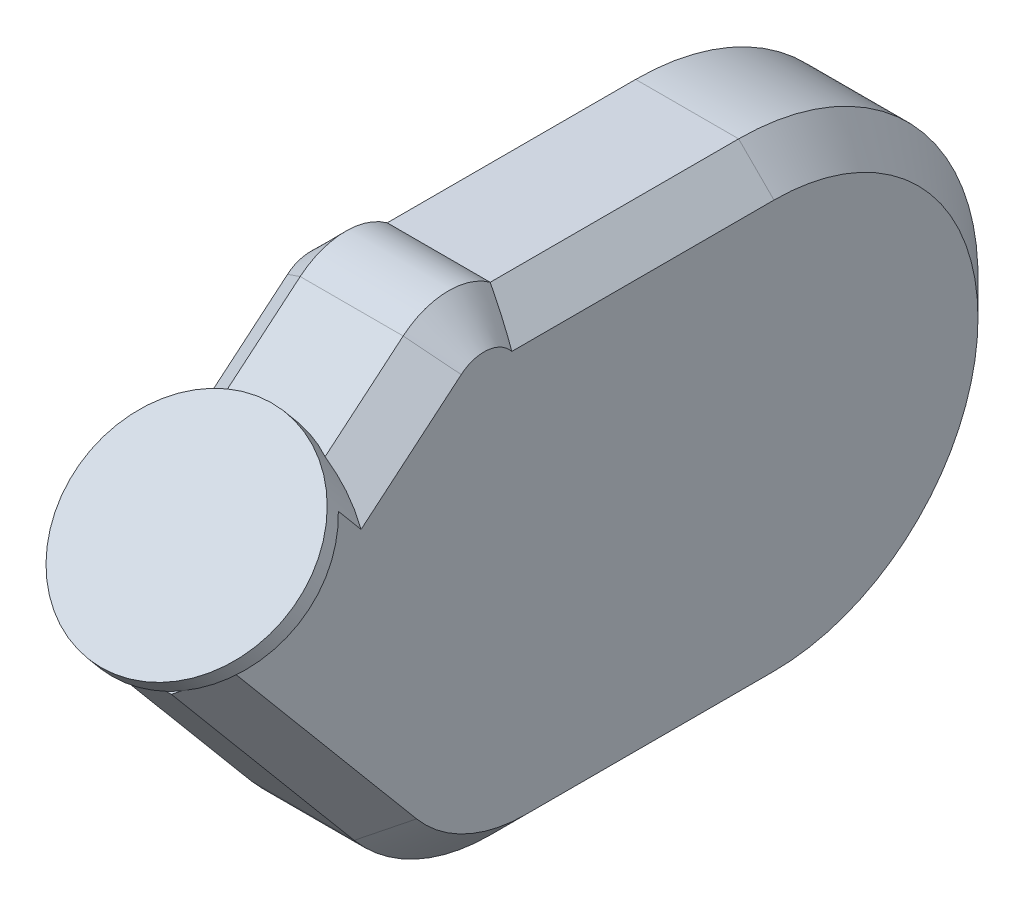
ISO-10303-21;
HEADER;
FILE_DESCRIPTION(('STEP AP214'),'2;1');
FILE_NAME('part.step','',(''),(''),'','','');
FILE_SCHEMA(('AUTOMOTIVE_DESIGN { 1 0 10303 214 1 1 1 1 }'));
ENDSEC;
DATA;
#1=APPLICATION_CONTEXT('core data for automotive mechanical design processes');
#2=APPLICATION_PROTOCOL_DEFINITION('international standard','automotive_design',2000,#1);
#3=PRODUCT_CONTEXT('',#1,'mechanical');
#4=PRODUCT('Part','Part','',(#3));
#5=PRODUCT_RELATED_PRODUCT_CATEGORY('part','',(#4));
#6=PRODUCT_DEFINITION_FORMATION('','',#4);
#7=PRODUCT_DEFINITION_CONTEXT('part definition',#1,'design');
#8=PRODUCT_DEFINITION('design','',#6,#7);
#9=PRODUCT_DEFINITION_SHAPE('','',#8);
#10=(LENGTH_UNIT() NAMED_UNIT(*) SI_UNIT(.MILLI.,.METRE.));
#11=(NAMED_UNIT(*) PLANE_ANGLE_UNIT() SI_UNIT($,.RADIAN.));
#12=(NAMED_UNIT(*) SI_UNIT($,.STERADIAN.) SOLID_ANGLE_UNIT());
#13=UNCERTAINTY_MEASURE_WITH_UNIT(LENGTH_MEASURE(1.E-05),#10,'distance_accuracy_value','');
#14=(GEOMETRIC_REPRESENTATION_CONTEXT(3) GLOBAL_UNCERTAINTY_ASSIGNED_CONTEXT((#13)) GLOBAL_UNIT_ASSIGNED_CONTEXT((#10,
#11,#12)) REPRESENTATION_CONTEXT('',''));
#15=CARTESIAN_POINT('',(0.,0.,0.));
#16=DIRECTION('',(0.,0.,1.));
#17=DIRECTION('',(1.,0.,0.));
#18=AXIS2_PLACEMENT_3D('',#15,#16,#17);
#19=CARTESIAN_POINT('',(25.0293014834067,1.5049102118823,28.9803417394481));
#20=DIRECTION('',(0.,0.766044443118977,0.64278760968654));
#21=DIRECTION('',(0.,-0.64278760968654,0.766044443118977));
#22=AXIS2_PLACEMENT_3D('',#19,#20,#21);
#23=PLANE('',#22);
#24=DIRECTION('',(-1.,0.,0.));
#25=VECTOR('',#24,1.);
#26=CARTESIAN_POINT('',(25.0293014834067,1.5049102118823,28.9803417394481));
#27=LINE('',#26,#25);
#28=CARTESIAN_POINT('',(1.84999999999999,1.5049102118823,28.9803417394481));
#29=VERTEX_POINT('',#28);
#30=CARTESIAN_POINT('',(1.65989094630084,1.50491021188229,28.9803417394481));
#31=VERTEX_POINT('',#30);
#32=EDGE_CURVE('E333',#29,#31,#27,.T.);
#33=ORIENTED_EDGE('',*,*,#32,.F.);
#34=DIRECTION('',(0.707106781186549,0.454519477672044,-0.5416752204197));
#35=VECTOR('',#34,1.);
#36=CARTESIAN_POINT('',(13.4396507417034,8.95459410924362,20.1021541910765));
#37=LINE('',#36,#35);
#38=CARTESIAN_POINT('',(2.05963838172714,1.63966316617124,28.8197494220615));
#39=VERTEX_POINT('',#38);
#40=EDGE_CURVE('E371',#29,#39,#37,.T.);
#41=ORIENTED_EDGE('',*,*,#40,.T.);
#42=CARTESIAN_POINT('',(0.,3.85179078102008,26.1834383897886));
#43=DIRECTION('',(0.,0.766044443118977,0.64278760968654));
#44=DIRECTION('',(0.,-0.64278760968654,0.766044443118977));
#45=AXIS2_PLACEMENT_3D('',#42,#43,#44);
#46=CIRCLE('',#45,4.01070501367834);
#47=EDGE_CURVE('E325',#31,#39,#46,.T.);
#48=ORIENTED_EDGE('',*,*,#47,.F.);
#49=EDGE_LOOP('',(#33,#41,#48));
#50=FACE_BOUND('',#49,.T.);
#51=ADVANCED_FACE('F30',(#50),#23,.T.);
#52=CARTESIAN_POINT('',(1.84999999999999,6.1391805164594,23.4574334549157));
#53=VERTEX_POINT('',#52);
#54=CARTESIAN_POINT('',(-1.85,6.13918051645939,23.4574334549157));
#55=VERTEX_POINT('',#54);
#56=EDGE_CURVE('E306',#53,#55,#46,.T.);
#57=ORIENTED_EDGE('',*,*,#56,.F.);
#58=DIRECTION('',(0.,0.64278760968654,-0.766044443118977));
#59=VECTOR('',#58,1.);
#60=CARTESIAN_POINT('',(1.84999999999999,8.49208832889431,20.6533471164034));
#61=LINE('',#60,#59);
#62=CARTESIAN_POINT('',(1.84999999999998,8.49208832889431,20.6533471164034));
#63=VERTEX_POINT('',#62);
#64=EDGE_CURVE('E252',#53,#63,#61,.T.);
#65=ORIENTED_EDGE('',*,*,#64,.T.);
#66=DIRECTION('',(1.,0.,0.));
#67=VECTOR('',#66,1.);
#68=CARTESIAN_POINT('',(-3.12,8.49208832889431,20.6533471164034));
#69=LINE('',#68,#67);
#70=CARTESIAN_POINT('',(-1.85,8.49208832889431,20.6533471164034));
#71=VERTEX_POINT('',#70);
#72=EDGE_CURVE('E297',#63,#71,#69,.F.);
#73=ORIENTED_EDGE('',*,*,#72,.T.);
#74=DIRECTION('',(0.,-0.64278760968654,0.766044443118977));
#75=VECTOR('',#74,1.);
#76=CARTESIAN_POINT('',(-1.85,5.47173731350227,24.2528612898924));
#77=LINE('',#76,#75);
#78=EDGE_CURVE('E250',#71,#55,#77,.T.);
#79=ORIENTED_EDGE('',*,*,#78,.T.);
#80=EDGE_LOOP('',(#57,#65,#73,#79));
#81=FACE_BOUND('',#80,.T.);
#82=ADVANCED_FACE('F302',(#81),#23,.T.);
#83=CARTESIAN_POINT('',(3.12000000000001,0.,8.6000082));
#84=DIRECTION('',(-1.,0.,0.));
#85=DIRECTION('',(0.,-1.,0.));
#86=AXIS2_PLACEMENT_3D('',#83,#84,#85);
#87=CYLINDRICAL_SURFACE('',#86,8.6000082);
#88=DIRECTION('',(1.,0.,0.));
#89=VECTOR('',#88,1.);
#90=CARTESIAN_POINT('',(3.12,8.6000082,8.6000082));
#91=LINE('',#90,#89);
#92=CARTESIAN_POINT('',(1.84999999999999,8.6000082,8.6000082));
#93=VERTEX_POINT('',#92);
#94=CARTESIAN_POINT('',(-1.85,8.60000819999999,8.6000082));
#95=VERTEX_POINT('',#94);
#96=EDGE_CURVE('E277',#93,#95,#91,.F.);
#97=ORIENTED_EDGE('',*,*,#96,.F.);
#98=CARTESIAN_POINT('',(1.84999999999999,0.,8.6000082));
#99=DIRECTION('',(-1.,0.,0.));
#100=DIRECTION('',(0.,-1.,0.));
#101=AXIS2_PLACEMENT_3D('',#98,#99,#100);
#102=CIRCLE('',#101,8.6000082);
#103=CARTESIAN_POINT('',(1.84999999999999,-8.6000082,8.6000082));
#104=VERTEX_POINT('',#103);
#105=EDGE_CURVE('E248',#93,#104,#102,.T.);
#106=ORIENTED_EDGE('',*,*,#105,.T.);
#107=DIRECTION('',(1.,0.,0.));
#108=VECTOR('',#107,1.);
#109=CARTESIAN_POINT('',(3.12000000000001,-8.6000082,8.6000082));
#110=LINE('',#109,#108);
#111=CARTESIAN_POINT('',(-1.84999999999999,-8.6000082,8.6000082));
#112=VERTEX_POINT('',#111);
#113=EDGE_CURVE('E279',#112,#104,#110,.T.);
#114=ORIENTED_EDGE('',*,*,#113,.F.);
#115=CARTESIAN_POINT('',(-1.85,0.,8.6000082));
#116=DIRECTION('',(1.,0.,0.));
#117=DIRECTION('',(0.,1.,0.));
#118=AXIS2_PLACEMENT_3D('',#115,#116,#117);
#119=CIRCLE('',#118,8.6000082);
#120=EDGE_CURVE('E242',#112,#95,#119,.T.);
#121=ORIENTED_EDGE('',*,*,#120,.T.);
#122=EDGE_LOOP('',(#97,#106,#114,#121));
#123=FACE_BOUND('',#122,.T.);
#124=ADVANCED_FACE('F276',(#123),#87,.T.);
#125=CARTESIAN_POINT('',(-3.12,8.60000819999999,17.526));
#126=DIRECTION('',(1.,0.,0.));
#127=DIRECTION('',(0.,1.,0.));
#128=AXIS2_PLACEMENT_3D('',#125,#126,#127);
#129=PLANE('',#128);
#130=DIRECTION('',(0.,0.64278760968654,-0.766044443118977));
#131=VECTOR('',#130,1.);
#132=CARTESIAN_POINT('',(-3.12,1.5049102118823,28.9803417394481));
#133=LINE('',#132,#131);
#134=CARTESIAN_POINT('',(-3.12,2.3212504761842,28.007465296687));
#135=VERTEX_POINT('',#134);
#136=CARTESIAN_POINT('',(-3.12,5.47173731350227,24.2528612898924));
#137=VERTEX_POINT('',#136);
#138=EDGE_CURVE('E313',#135,#137,#133,.T.);
#139=ORIENTED_EDGE('',*,*,#138,.T.);
#140=DIRECTION('',(0.,-0.766044443118977,-0.64278760968654));
#141=VECTOR('',#140,1.);
#142=CARTESIAN_POINT('',(-3.12,5.47173731350227,24.2528612898924));
#143=LINE('',#142,#141);
#144=CARTESIAN_POINT('',(-3.12,4.49886087074117,23.4365210255905));
#145=VERTEX_POINT('',#144);
#146=EDGE_CURVE('E47',#137,#145,#143,.T.);
#147=ORIENTED_EDGE('',*,*,#146,.T.);
#148=DIRECTION('',(0.,0.64278760968654,-0.766044443118977));
#149=VECTOR('',#148,1.);
#150=CARTESIAN_POINT('',(-3.12,7.51921188613321,19.8370068521015));
#151=LINE('',#150,#149);
#152=CARTESIAN_POINT('',(-3.12,7.5192118861332,19.8370068521015));
#153=VERTEX_POINT('',#152);
#154=EDGE_CURVE('E266',#145,#153,#151,.T.);
#155=ORIENTED_EDGE('',*,*,#154,.T.);
#156=CARTESIAN_POINT('',(-3.12,6.5463354433721,19.0206665877996));
#157=DIRECTION('',(1.,0.,0.));
#158=DIRECTION('',(0.,1.,0.));
#159=AXIS2_PLACEMENT_3D('',#156,#157,#158);
#160=CIRCLE('',#159,1.27);
#161=CARTESIAN_POINT('',(-3.12,7.33000819999999,18.0212882757879));
#162=VERTEX_POINT('',#161);
#163=EDGE_CURVE('E262',#153,#162,#160,.F.);
#164=ORIENTED_EDGE('',*,*,#163,.T.);
#165=DIRECTION('',(0.,0.,-1.));
#166=VECTOR('',#165,1.);
#167=CARTESIAN_POINT('',(-3.12,7.3300082,17.526));
#168=LINE('',#167,#166);
#169=CARTESIAN_POINT('',(-3.12,7.3300082,8.6000082));
#170=VERTEX_POINT('',#169);
#171=EDGE_CURVE('E264',#162,#170,#168,.T.);
#172=ORIENTED_EDGE('',*,*,#171,.T.);
#173=CARTESIAN_POINT('',(-3.12,0.,8.6000082));
#174=DIRECTION('',(1.,0.,0.));
#175=DIRECTION('',(0.,1.,0.));
#176=AXIS2_PLACEMENT_3D('',#173,#174,#175);
#177=CIRCLE('',#176,7.3300082);
#178=CARTESIAN_POINT('',(-3.12,-7.3300082,8.6000082));
#179=VERTEX_POINT('',#178);
#180=EDGE_CURVE('E268',#170,#179,#177,.F.);
#181=ORIENTED_EDGE('',*,*,#180,.T.);
#182=DIRECTION('',(0.,0.,1.));
#183=VECTOR('',#182,1.);
#184=CARTESIAN_POINT('',(-3.12,-7.3300082,17.526));
#185=LINE('',#184,#183);
#186=CARTESIAN_POINT('',(-3.12,-7.3300082,17.526));
#187=VERTEX_POINT('',#186);
#188=EDGE_CURVE('E132',#179,#187,#185,.T.);
#189=ORIENTED_EDGE('',*,*,#188,.T.);
#190=CARTESIAN_POINT('',(-3.12,-2.21943868773147,17.526));
#191=DIRECTION('',(1.,0.,0.));
#192=DIRECTION('',(0.,1.,0.));
#193=AXIS2_PLACEMENT_3D('',#190,#191,#192);
#194=CIRCLE('',#193,5.11056951226853);
#195=CARTESIAN_POINT('',(-3.12,-5.50444944865947,21.4409233760466));
#196=VERTEX_POINT('',#195);
#197=EDGE_CURVE('E136',#187,#196,#194,.F.);
#198=ORIENTED_EDGE('',*,*,#197,.T.);
#199=DIRECTION('',(0.,0.766044443118977,0.64278760968654));
#200=VECTOR('',#199,1.);
#201=CARTESIAN_POINT('',(-3.12,2.3212504761842,28.007465296687));
#202=LINE('',#201,#200);
#203=EDGE_CURVE('E140',#196,#135,#202,.T.);
#204=ORIENTED_EDGE('',*,*,#203,.T.);
#205=EDGE_LOOP('',(#139,#147,#155,#164,#172,#181,#189,#198,#204));
#206=FACE_BOUND('',#205,.T.);
#207=ADVANCED_FACE('F138',(#206),#129,.F.);
#208=CARTESIAN_POINT('',(3.12,-8.6000082,17.526));
#209=DIRECTION('',(0.,1.,0.));
#210=DIRECTION('',(0.,0.,1.));
#211=AXIS2_PLACEMENT_3D('',#208,#209,#210);
#212=PLANE('',#211);
#213=ORIENTED_EDGE('',*,*,#113,.T.);
#214=DIRECTION('',(0.,0.,1.));
#215=VECTOR('',#214,1.);
#216=CARTESIAN_POINT('',(1.84999999999999,-8.6000082,17.526));
#217=LINE('',#216,#215);
#218=CARTESIAN_POINT('',(1.84999999999999,-8.6000082,17.526));
#219=VERTEX_POINT('',#218);
#220=EDGE_CURVE('E239',#104,#219,#217,.T.);
#221=ORIENTED_EDGE('',*,*,#220,.T.);
#222=DIRECTION('',(1.,0.,0.));
#223=VECTOR('',#222,1.);
#224=CARTESIAN_POINT('',(3.12,-8.6000082,17.526));
#225=LINE('',#224,#223);
#226=CARTESIAN_POINT('',(-1.85,-8.6000082,17.526));
#227=VERTEX_POINT('',#226);
#228=EDGE_CURVE('E332',#227,#219,#225,.T.);
#229=ORIENTED_EDGE('',*,*,#228,.F.);
#230=DIRECTION('',(0.,0.,-1.));
#231=VECTOR('',#230,1.);
#232=CARTESIAN_POINT('',(-1.85,-8.6000082,17.526));
#233=LINE('',#232,#231);
#234=EDGE_CURVE('E233',#227,#112,#233,.T.);
#235=ORIENTED_EDGE('',*,*,#234,.T.);
#236=EDGE_LOOP('',(#213,#221,#229,#235));
#237=FACE_BOUND('',#236,.T.);
#238=ADVANCED_FACE('F375',(#237),#212,.F.);
#239=CARTESIAN_POINT('',(3.12,8.6000082,17.526));
#240=DIRECTION('',(-1.,0.,0.));
#241=DIRECTION('',(0.,-1.,0.));
#242=AXIS2_PLACEMENT_3D('',#239,#240,#241);
#243=PLANE('',#242);
#244=DIRECTION('',(0.,-0.64278760968654,0.766044443118977));
#245=VECTOR('',#244,1.);
#246=CARTESIAN_POINT('',(3.12,4.49886087074117,23.4365210255905));
#247=LINE('',#246,#245);
#248=CARTESIAN_POINT('',(3.12,7.51921188613319,19.8370068521015));
#249=VERTEX_POINT('',#248);
#250=CARTESIAN_POINT('',(3.12,4.49886087074117,23.4365210255905));
#251=VERTEX_POINT('',#250);
#252=EDGE_CURVE('E349',#249,#251,#247,.T.);
#253=ORIENTED_EDGE('',*,*,#252,.T.);
#254=DIRECTION('',(0.,-0.766044443118977,-0.64278760968654));
#255=VECTOR('',#254,1.);
#256=CARTESIAN_POINT('',(3.12,4.49886087074117,23.4365210255905));
#257=LINE('',#256,#255);
#258=CARTESIAN_POINT('',(3.12,5.47173731350227,24.2528612898924));
#259=VERTEX_POINT('',#258);
#260=EDGE_CURVE('E364',#251,#259,#257,.F.);
#261=ORIENTED_EDGE('',*,*,#260,.T.);
#262=DIRECTION('',(0.,-0.64278760968654,0.766044443118977));
#263=VECTOR('',#262,1.);
#264=CARTESIAN_POINT('',(3.12,1.5049102118823,28.9803417394481));
#265=LINE('',#264,#263);
#266=CARTESIAN_POINT('',(3.12,2.32125047618421,28.007465296687));
#267=VERTEX_POINT('',#266);
#268=EDGE_CURVE('E330',#259,#267,#265,.T.);
#269=ORIENTED_EDGE('',*,*,#268,.T.);
#270=DIRECTION('',(0.,-0.766044443118977,-0.64278760968654));
#271=VECTOR('',#270,1.);
#272=CARTESIAN_POINT('',(3.12,-5.50444944865946,21.4409233760466));
#273=LINE('',#272,#271);
#274=CARTESIAN_POINT('',(3.12,-5.50444944865946,21.4409233760466));
#275=VERTEX_POINT('',#274);
#276=EDGE_CURVE('E361',#267,#275,#273,.T.);
#277=ORIENTED_EDGE('',*,*,#276,.T.);
#278=CARTESIAN_POINT('',(3.12,-2.21943868773147,17.526));
#279=DIRECTION('',(-1.,0.,0.));
#280=DIRECTION('',(0.,-1.,0.));
#281=AXIS2_PLACEMENT_3D('',#278,#279,#280);
#282=CIRCLE('',#281,5.11056951226852);
#283=CARTESIAN_POINT('',(3.12,-7.33000819999999,17.526));
#284=VERTEX_POINT('',#283);
#285=EDGE_CURVE('E358',#275,#284,#282,.F.);
#286=ORIENTED_EDGE('',*,*,#285,.T.);
#287=DIRECTION('',(0.,0.,-1.));
#288=VECTOR('',#287,1.);
#289=CARTESIAN_POINT('',(3.12,-7.33000819999999,17.526));
#290=LINE('',#289,#288);
#291=CARTESIAN_POINT('',(3.12,-7.33000819999999,8.6000082));
#292=VERTEX_POINT('',#291);
#293=EDGE_CURVE('E355',#284,#292,#290,.T.);
#294=ORIENTED_EDGE('',*,*,#293,.T.);
#295=CARTESIAN_POINT('',(3.12,0.,8.6000082));
#296=DIRECTION('',(-1.,0.,0.));
#297=DIRECTION('',(0.,-1.,0.));
#298=AXIS2_PLACEMENT_3D('',#295,#296,#297);
#299=CIRCLE('',#298,7.33000819999998);
#300=CARTESIAN_POINT('',(3.12,7.33000819999999,8.6000082));
#301=VERTEX_POINT('',#300);
#302=EDGE_CURVE('E352',#292,#301,#299,.F.);
#303=ORIENTED_EDGE('',*,*,#302,.T.);
#304=DIRECTION('',(0.,0.,1.));
#305=VECTOR('',#304,1.);
#306=CARTESIAN_POINT('',(3.12,7.33000819999999,17.526));
#307=LINE('',#306,#305);
#308=CARTESIAN_POINT('',(3.12,7.33000819999998,18.0212882757879));
#309=VERTEX_POINT('',#308);
#310=EDGE_CURVE('E346',#301,#309,#307,.T.);
#311=ORIENTED_EDGE('',*,*,#310,.T.);
#312=CARTESIAN_POINT('',(3.12,6.5463354433721,19.0206665877996));
#313=DIRECTION('',(-1.,0.,0.));
#314=DIRECTION('',(0.,-1.,0.));
#315=AXIS2_PLACEMENT_3D('',#312,#313,#314);
#316=CIRCLE('',#315,1.26999999999999);
#317=EDGE_CURVE('E305',#309,#249,#316,.F.);
#318=ORIENTED_EDGE('',*,*,#317,.T.);
#319=EDGE_LOOP('',(#253,#261,#269,#277,#286,#294,#303,#311,#318));
#320=FACE_BOUND('',#319,.T.);
#321=ADVANCED_FACE('F471',(#320),#243,.F.);
#322=CARTESIAN_POINT('',(3.12,8.6000082,17.526));
#323=DIRECTION('',(0.,-1.,0.));
#324=DIRECTION('',(1.,0.,0.));
#325=AXIS2_PLACEMENT_3D('',#322,#323,#324);
#326=PLANE('',#325);
#327=DIRECTION('',(-1.,0.,0.));
#328=VECTOR('',#327,1.);
#329=CARTESIAN_POINT('',(3.12,8.6000082,17.526));
#330=LINE('',#329,#328);
#331=CARTESIAN_POINT('',(1.84999999999999,8.6000082,17.526));
#332=VERTEX_POINT('',#331);
#333=CARTESIAN_POINT('',(-1.85,8.60000819999999,17.526));
#334=VERTEX_POINT('',#333);
#335=EDGE_CURVE('E286',#332,#334,#330,.T.);
#336=ORIENTED_EDGE('',*,*,#335,.F.);
#337=DIRECTION('',(0.,0.,-1.));
#338=VECTOR('',#337,1.);
#339=CARTESIAN_POINT('',(1.84999999999999,8.6000082,17.526));
#340=LINE('',#339,#338);
#341=EDGE_CURVE('E256',#332,#93,#340,.T.);
#342=ORIENTED_EDGE('',*,*,#341,.T.);
#343=ORIENTED_EDGE('',*,*,#96,.T.);
#344=DIRECTION('',(0.,0.,1.));
#345=VECTOR('',#344,1.);
#346=CARTESIAN_POINT('',(-1.85,8.60000819999999,17.526));
#347=LINE('',#346,#345);
#348=EDGE_CURVE('E254',#95,#334,#347,.T.);
#349=ORIENTED_EDGE('',*,*,#348,.T.);
#350=EDGE_LOOP('',(#336,#342,#343,#349));
#351=FACE_BOUND('',#350,.T.);
#352=ADVANCED_FACE('F283',(#351),#326,.F.);
#353=CARTESIAN_POINT('',(25.0293014834067,-2.21943868773147,17.526));
#354=DIRECTION('',(-1.,0.,0.));
#355=DIRECTION('',(0.,-1.,0.));
#356=AXIS2_PLACEMENT_3D('',#353,#354,#355);
#357=CYLINDRICAL_SURFACE('',#356,6.38056951226853);
#358=ORIENTED_EDGE('',*,*,#228,.T.);
#359=CARTESIAN_POINT('',(1.84999999999998,-2.21943868773147,17.526));
#360=DIRECTION('',(-1.,0.,0.));
#361=DIRECTION('',(0.,0.,1.));
#362=AXIS2_PLACEMENT_3D('',#359,#360,#361);
#363=CIRCLE('',#362,6.38056951226853);
#364=CARTESIAN_POINT('',(1.84999999999998,-6.32078971296137,22.4137998188077));
#365=VERTEX_POINT('',#364);
#366=EDGE_CURVE('E240',#219,#365,#363,.T.);
#367=ORIENTED_EDGE('',*,*,#366,.T.);
#368=DIRECTION('',(-1.,0.,0.));
#369=VECTOR('',#368,1.);
#370=CARTESIAN_POINT('',(25.0293014834067,-6.32078971296137,22.4137998188077));
#371=LINE('',#370,#369);
#372=CARTESIAN_POINT('',(-1.85,-6.32078971296137,22.4137998188077));
#373=VERTEX_POINT('',#372);
#374=EDGE_CURVE('E316',#365,#373,#371,.T.);
#375=ORIENTED_EDGE('',*,*,#374,.T.);
#376=CARTESIAN_POINT('',(-1.85,-2.21943868773147,17.526));
#377=DIRECTION('',(1.,0.,0.));
#378=DIRECTION('',(0.,1.,0.));
#379=AXIS2_PLACEMENT_3D('',#376,#377,#378);
#380=CIRCLE('',#379,6.38056951226853);
#381=EDGE_CURVE('E149',#373,#227,#380,.T.);
#382=ORIENTED_EDGE('',*,*,#381,.T.);
#383=EDGE_LOOP('',(#358,#367,#375,#382));
#384=FACE_BOUND('',#383,.T.);
#385=ADVANCED_FACE('F373',(#384),#357,.T.);
#386=CARTESIAN_POINT('',(-2.05963838172718,1.63966316617126,28.8197494220615));
#387=VERTEX_POINT('',#386);
#388=CARTESIAN_POINT('',(-1.65989094630084,1.50491021188229,28.9803417394481));
#389=VERTEX_POINT('',#388);
#390=EDGE_CURVE('E329',#387,#389,#46,.T.);
#391=ORIENTED_EDGE('',*,*,#390,.F.);
#392=DIRECTION('',(0.707106781186549,-0.454519477672044,0.5416752204197));
#393=VECTOR('',#392,1.);
#394=CARTESIAN_POINT('',(11.5896507417034,-7.13393076339913,39.2757115075897));
#395=LINE('',#394,#393);
#396=CARTESIAN_POINT('',(-1.85,1.5049102118823,28.9803417394481));
#397=VERTEX_POINT('',#396);
#398=EDGE_CURVE('E157',#387,#397,#395,.T.);
#399=ORIENTED_EDGE('',*,*,#398,.T.);
#400=EDGE_CURVE('E338',#389,#397,#27,.T.);
#401=ORIENTED_EDGE('',*,*,#400,.F.);
#402=EDGE_LOOP('',(#391,#399,#401));
#403=FACE_BOUND('',#402,.T.);
#404=ADVANCED_FACE('F428',(#403),#23,.T.);
#405=CARTESIAN_POINT('',(25.0293014834067,-6.32078971296137,22.4137998188077));
#406=DIRECTION('',(0.,-0.64278760968654,0.766044443118977));
#407=DIRECTION('',(0.,-0.766044443118977,-0.64278760968654));
#408=AXIS2_PLACEMENT_3D('',#405,#406,#407);
#409=PLANE('',#408);
#410=ORIENTED_EDGE('',*,*,#374,.F.);
#411=DIRECTION('',(0.,0.766044443118977,0.64278760968654));
#412=VECTOR('',#411,1.);
#413=CARTESIAN_POINT('',(1.84999999999999,1.5049102118823,28.9803417394481));
#414=LINE('',#413,#412);
#415=EDGE_CURVE('E368',#365,#29,#414,.T.);
#416=ORIENTED_EDGE('',*,*,#415,.T.);
#417=ORIENTED_EDGE('',*,*,#32,.T.);
#418=EDGE_CURVE('E337',#31,#389,#27,.T.);
#419=ORIENTED_EDGE('',*,*,#418,.T.);
#420=ORIENTED_EDGE('',*,*,#400,.T.);
#421=DIRECTION('',(0.,-0.766044443118977,-0.64278760968654));
#422=VECTOR('',#421,1.);
#423=CARTESIAN_POINT('',(-1.85,-6.32078971296137,22.4137998188077));
#424=LINE('',#423,#422);
#425=EDGE_CURVE('E72',#397,#373,#424,.T.);
#426=ORIENTED_EDGE('',*,*,#425,.T.);
#427=EDGE_LOOP('',(#410,#416,#417,#419,#420,#426));
#428=FACE_BOUND('',#427,.T.);
#429=ADVANCED_FACE('F389',(#428),#409,.T.);
#430=CARTESIAN_POINT('',(0.,3.85179078102008,26.1834383897886));
#431=DIRECTION('',(0.,0.766044443118977,0.64278760968654));
#432=DIRECTION('',(0.,-0.64278760968654,0.766044443118977));
#433=AXIS2_PLACEMENT_3D('',#430,#431,#432);
#434=PLANE('',#433);
#435=ORIENTED_EDGE('',*,*,#268,.F.);
#436=EDGE_CURVE('E60',#39,#259,#46,.T.);
#437=ORIENTED_EDGE('',*,*,#436,.F.);
#438=DIRECTION('',(0.707106781186549,0.454519477672044,-0.5416752204197));
#439=VECTOR('',#438,1.);
#440=CARTESIAN_POINT('',(2.75054901010168,2.08377195749114,28.2904811745034));
#441=LINE('',#440,#439);
#442=EDGE_CURVE('E163',#39,#267,#441,.T.);
#443=ORIENTED_EDGE('',*,*,#442,.T.);
#444=EDGE_LOOP('',(#435,#437,#443));
#445=FACE_BOUND('',#444,.T.);
#446=ADVANCED_FACE('F435',(#445),#434,.F.);
#447=ORIENTED_EDGE('',*,*,#138,.F.);
#448=DIRECTION('',(0.707106781186549,-0.454519477672043,0.541675220419701));
#449=VECTOR('',#448,1.);
#450=CARTESIAN_POINT('',(-2.75054901010169,2.08377195749113,28.2904811745034));
#451=LINE('',#450,#449);
#452=EDGE_CURVE('E40',#135,#387,#451,.T.);
#453=ORIENTED_EDGE('',*,*,#452,.T.);
#454=EDGE_CURVE('E319',#137,#387,#46,.T.);
#455=ORIENTED_EDGE('',*,*,#454,.F.);
#456=EDGE_LOOP('',(#447,#453,#455));
#457=FACE_BOUND('',#456,.T.);
#458=ADVANCED_FACE('F320',(#457),#434,.F.);
#459=CARTESIAN_POINT('',(0.,4.32922789500069,26.58405569604));
#460=DIRECTION('',(0.,-0.766044443118977,-0.64278760968654));
#461=DIRECTION('',(0.,0.64278760968654,-0.766044443118977));
#462=AXIS2_PLACEMENT_3D('',#459,#460,#461);
#463=CYLINDRICAL_SURFACE('',#462,4.01070501367834);
#464=CARTESIAN_POINT('',(0.,4.32922789500069,26.58405569604));
#465=DIRECTION('',(0.,0.766044443118977,0.64278760968654));
#466=DIRECTION('',(0.,-0.64278760968654,0.766044443118977));
#467=AXIS2_PLACEMENT_3D('',#464,#465,#466);
#468=CIRCLE('',#467,4.01070501367834);
#469=CARTESIAN_POINT('',(0.,1.75119640610057,29.6564339847578));
#470=VERTEX_POINT('',#469);
#471=EDGE_CURVE('E317',#470,#470,#468,.T.);
#472=ORIENTED_EDGE('',*,*,#471,.F.);
#473=EDGE_LOOP('',(#472));
#474=FACE_BOUND('',#473,.T.);
#475=ORIENTED_EDGE('',*,*,#47,.T.);
#476=ORIENTED_EDGE('',*,*,#436,.T.);
#477=ORIENTED_EDGE('',*,*,#260,.F.);
#478=CARTESIAN_POINT('',(0.,5.26897300079019,27.3725954677087));
#479=DIRECTION('',(0.707106781186547,0.541675220419702,0.454519477672045));
#480=DIRECTION('',(0.707106781186548,-0.541675220419701,-0.454519477672044));
#481=AXIS2_PLACEMENT_3D('',#478,#479,#480);
#482=ELLIPSE('',#481,5.67199342502167,4.01070501367834);
#483=EDGE_CURVE('E165',#251,#53,#482,.T.);
#484=ORIENTED_EDGE('',*,*,#483,.T.);
#485=ORIENTED_EDGE('',*,*,#56,.T.);
#486=CARTESIAN_POINT('',(0.,5.26897300079019,27.3725954677087));
#487=DIRECTION('',(-0.707106781186547,0.541675220419702,0.454519477672045));
#488=DIRECTION('',(-0.707106781186549,-0.541675220419701,-0.454519477672043));
#489=AXIS2_PLACEMENT_3D('',#486,#487,#488);
#490=ELLIPSE('',#489,5.67199342502167,4.01070501367834);
#491=EDGE_CURVE('E11',#55,#145,#490,.T.);
#492=ORIENTED_EDGE('',*,*,#491,.T.);
#493=ORIENTED_EDGE('',*,*,#146,.F.);
#494=ORIENTED_EDGE('',*,*,#454,.T.);
#495=ORIENTED_EDGE('',*,*,#390,.T.);
#496=EDGE_CURVE('E323',#389,#31,#46,.T.);
#497=ORIENTED_EDGE('',*,*,#496,.T.);
#498=EDGE_LOOP('',(#475,#476,#477,#484,#485,#492,#493,#494,#495,#497));
#499=FACE_BOUND('',#498,.T.);
#500=ADVANCED_FACE('F312',(#474,#499),#463,.T.);
#501=CARTESIAN_POINT('',(0.,4.32922789500069,26.58405569604));
#502=DIRECTION('',(0.,0.766044443118977,0.64278760968654));
#503=DIRECTION('',(0.,-0.64278760968654,0.766044443118977));
#504=AXIS2_PLACEMENT_3D('',#501,#502,#503);
#505=PLANE('',#504);
#506=ORIENTED_EDGE('',*,*,#471,.T.);
#507=EDGE_LOOP('',(#506));
#508=FACE_BOUND('',#507,.T.);
#509=ADVANCED_FACE('F483',(#508),#505,.T.);
#510=ORIENTED_EDGE('',*,*,#418,.F.);
#511=ORIENTED_EDGE('',*,*,#496,.F.);
#512=EDGE_LOOP('',(#510,#511));
#513=FACE_BOUND('',#512,.T.);
#514=ADVANCED_FACE('F411',(#513),#434,.F.);
#515=CARTESIAN_POINT('',(25.0293014834067,6.54633544337211,19.0206665877996));
#516=DIRECTION('',(-1.,0.,0.));
#517=DIRECTION('',(0.,-1.,0.));
#518=AXIS2_PLACEMENT_3D('',#515,#516,#517);
#519=CYLINDRICAL_SURFACE('',#518,2.54);
#520=ORIENTED_EDGE('',*,*,#72,.F.);
#521=CARTESIAN_POINT('',(1.84999999999999,6.5463354433721,19.0206665877996));
#522=DIRECTION('',(-1.,0.,0.));
#523=DIRECTION('',(0.,0.,1.));
#524=AXIS2_PLACEMENT_3D('',#521,#522,#523);
#525=CIRCLE('',#524,2.54);
#526=EDGE_CURVE('E260',#63,#332,#525,.T.);
#527=ORIENTED_EDGE('',*,*,#526,.T.);
#528=ORIENTED_EDGE('',*,*,#335,.T.);
#529=CARTESIAN_POINT('',(-1.85,6.5463354433721,19.0206665877996));
#530=DIRECTION('',(1.,0.,0.));
#531=DIRECTION('',(0.,1.,0.));
#532=AXIS2_PLACEMENT_3D('',#529,#530,#531);
#533=CIRCLE('',#532,2.54);
#534=EDGE_CURVE('E258',#334,#71,#533,.T.);
#535=ORIENTED_EDGE('',*,*,#534,.T.);
#536=EDGE_LOOP('',(#520,#527,#528,#535));
#537=FACE_BOUND('',#536,.T.);
#538=ADVANCED_FACE('F200',(#537),#519,.T.);
#539=CARTESIAN_POINT('',(3.12,9.10371962050749,17.9486640671676));
#540=DIRECTION('',(0.707106781186547,0.541675220419702,0.454519477672045));
#541=DIRECTION('',(-0.608120402411343,0.793844806099446,0.));
#542=AXIS2_PLACEMENT_3D('',#539,#540,#541);
#543=PLANE('',#542);
#544=ORIENTED_EDGE('',*,*,#483,.F.);
#545=ORIENTED_EDGE('',*,*,#252,.F.);
#546=DIRECTION('',(0.707106781186548,-0.541675220419701,-0.454519477672044));
#547=VECTOR('',#546,1.);
#548=CARTESIAN_POINT('',(1.84999999999999,8.49208832889432,20.6533471164034));
#549=LINE('',#548,#547);
#550=EDGE_CURVE('E188',#63,#249,#549,.T.);
#551=ORIENTED_EDGE('',*,*,#550,.F.);
#552=ORIENTED_EDGE('',*,*,#64,.F.);
#553=EDGE_LOOP('',(#544,#545,#551,#552));
#554=FACE_BOUND('',#553,.T.);
#555=ADVANCED_FACE('F196',(#554),#543,.T.);
#556=CARTESIAN_POINT('',(3.12,6.5463354433721,19.0206665877996));
#557=DIRECTION('',(-1.,0.,0.));
#558=DIRECTION('',(0.,0.,1.));
#559=AXIS2_PLACEMENT_3D('',#556,#557,#558);
#560=CONICAL_SURFACE('',#559,1.26999999999999,0.785398163397448);
#561=ORIENTED_EDGE('',*,*,#550,.T.);
#562=ORIENTED_EDGE('',*,*,#317,.F.);
#563=CARTESIAN_POINT('',(3.12,7.33000819999999,18.0212882757879));
#564=CARTESIAN_POINT('',(3.03687313387349,7.41313506612649,17.9809173884044));
#565=CARTESIAN_POINT('',(2.95326816819517,7.49674003180482,17.9425988846454));
#566=CARTESIAN_POINT('',(2.7853485215056,7.66465967849439,17.869300848494));
#567=CARTESIAN_POINT('',(2.70103401434127,7.74897418565872,17.8343205227154));
#568=CARTESIAN_POINT('',(2.53197185308748,7.91803634691251,17.7669424100604));
#569=CARTESIAN_POINT('',(2.4472246147192,8.00278358528079,17.7345425120384));
#570=CARTESIAN_POINT('',(2.27734138713287,8.17266681286711,17.6718304326483));
#571=CARTESIAN_POINT('',(2.19220538054411,8.25780281945588,17.6415183455594));
#572=CARTESIAN_POINT('',(2.06417499022131,8.38583320977867,17.597316107857));
#573=CARTESIAN_POINT('',(2.02139183930028,8.4286163606997,17.5827761898642));
#574=CARTESIAN_POINT('',(1.93574917675495,8.51425902324503,17.5540959154589));
#575=CARTESIAN_POINT('',(1.89288965106738,8.55711854893261,17.5399556430004));
#576=CARTESIAN_POINT('',(1.8500000000001,8.60000819999988,17.5259999999993));
#577=B_SPLINE_CURVE_WITH_KNOTS('',3,(#563,#564,#565,#566,#567,#568,#569,#570,#571,#572,#573,
#574,#575,#576),.UNSPECIFIED.,.F.,.F.,(4,2,2,2,2,2,4),(0.,0.372835887878817,0.745582941854364,
1.11802183587732,1.49047753709289,1.6771576283039,1.86387664851602),.UNSPECIFIED.);
#578=EDGE_CURVE('E180',#332,#309,#577,.F.);
#579=ORIENTED_EDGE('',*,*,#578,.F.);
#580=ORIENTED_EDGE('',*,*,#526,.F.);
#581=EDGE_LOOP('',(#561,#562,#579,#580));
#582=FACE_BOUND('',#581,.T.);
#583=ADVANCED_FACE('F192',(#582),#560,.T.);
#584=CARTESIAN_POINT('',(1.84999999999998,8.6000082,17.526));
#585=DIRECTION('',(-0.707106781186546,-0.707106781186549,0.));
#586=DIRECTION('',(0.707106781186549,-0.707106781186546,0.));
#587=AXIS2_PLACEMENT_3D('',#584,#585,#586);
#588=PLANE('',#587);
#589=ORIENTED_EDGE('',*,*,#578,.T.);
#590=ORIENTED_EDGE('',*,*,#310,.F.);
#591=DIRECTION('',(0.707106781186548,-0.707106781186547,0.));
#592=VECTOR('',#591,1.);
#593=CARTESIAN_POINT('',(1.84999999999999,8.6000082,8.6000082));
#594=LINE('',#593,#592);
#595=EDGE_CURVE('E177',#93,#301,#594,.T.);
#596=ORIENTED_EDGE('',*,*,#595,.F.);
#597=ORIENTED_EDGE('',*,*,#341,.F.);
#598=EDGE_LOOP('',(#589,#590,#596,#597));
#599=FACE_BOUND('',#598,.T.);
#600=ADVANCED_FACE('F189',(#599),#588,.F.);
#601=CARTESIAN_POINT('',(3.12,0.,8.6000082));
#602=DIRECTION('',(-1.,0.,0.));
#603=DIRECTION('',(0.,-1.,0.));
#604=AXIS2_PLACEMENT_3D('',#601,#602,#603);
#605=CONICAL_SURFACE('',#604,7.33000819999999,0.785398163397447);
#606=ORIENTED_EDGE('',*,*,#595,.T.);
#607=ORIENTED_EDGE('',*,*,#302,.F.);
#608=DIRECTION('',(0.707106781186547,0.707106781186548,0.));
#609=VECTOR('',#608,1.);
#610=CARTESIAN_POINT('',(1.84999999999999,-8.6000082,8.6000082));
#611=LINE('',#610,#609);
#612=EDGE_CURVE('E174',#104,#292,#611,.T.);
#613=ORIENTED_EDGE('',*,*,#612,.F.);
#614=ORIENTED_EDGE('',*,*,#105,.F.);
#615=EDGE_LOOP('',(#606,#607,#613,#614));
#616=FACE_BOUND('',#615,.T.);
#617=ADVANCED_FACE('F458',(#616),#605,.T.);
#618=CARTESIAN_POINT('',(3.12,-7.33000819999999,17.526));
#619=DIRECTION('',(-0.707106781186547,0.707106781186548,0.));
#620=DIRECTION('',(-0.707106781186548,-0.707106781186547,0.));
#621=AXIS2_PLACEMENT_3D('',#618,#619,#620);
#622=PLANE('',#621);
#623=ORIENTED_EDGE('',*,*,#612,.T.);
#624=ORIENTED_EDGE('',*,*,#293,.F.);
#625=DIRECTION('',(0.707106781186548,0.707106781186547,0.));
#626=VECTOR('',#625,1.);
#627=CARTESIAN_POINT('',(1.84999999999999,-8.6000082,17.526));
#628=LINE('',#627,#626);
#629=EDGE_CURVE('E171',#219,#284,#628,.T.);
#630=ORIENTED_EDGE('',*,*,#629,.F.);
#631=ORIENTED_EDGE('',*,*,#220,.F.);
#632=EDGE_LOOP('',(#623,#624,#630,#631));
#633=FACE_BOUND('',#632,.T.);
#634=ADVANCED_FACE('F379',(#633),#622,.F.);
#635=CARTESIAN_POINT('',(3.12,-2.21943868773147,17.526));
#636=DIRECTION('',(-1.,0.,0.));
#637=DIRECTION('',(0.,0.,1.));
#638=AXIS2_PLACEMENT_3D('',#635,#636,#637);
#639=CONICAL_SURFACE('',#638,5.11056951226852,0.785398163397446);
#640=ORIENTED_EDGE('',*,*,#629,.T.);
#641=ORIENTED_EDGE('',*,*,#285,.F.);
#642=DIRECTION('',(0.707106781186549,0.454519477672043,-0.5416752204197));
#643=VECTOR('',#642,1.);
#644=CARTESIAN_POINT('',(1.84999999999998,-6.32078971296137,22.4137998188077));
#645=LINE('',#644,#643);
#646=EDGE_CURVE('E168',#365,#275,#645,.T.);
#647=ORIENTED_EDGE('',*,*,#646,.F.);
#648=ORIENTED_EDGE('',*,*,#366,.F.);
#649=EDGE_LOOP('',(#640,#641,#647,#648));
#650=FACE_BOUND('',#649,.T.);
#651=ADVANCED_FACE('F387',(#650),#639,.T.);
#652=CARTESIAN_POINT('',(3.12,0.844662612915616,26.7684609652174));
#653=DIRECTION('',(0.707106781186546,-0.454519477672045,0.541675220419702));
#654=DIRECTION('',(0.608120402411344,0.,-0.793844806099445));
#655=AXIS2_PLACEMENT_3D('',#652,#653,#654);
#656=PLANE('',#655);
#657=ORIENTED_EDGE('',*,*,#40,.F.);
#658=ORIENTED_EDGE('',*,*,#415,.F.);
#659=ORIENTED_EDGE('',*,*,#646,.T.);
#660=ORIENTED_EDGE('',*,*,#276,.F.);
#661=ORIENTED_EDGE('',*,*,#442,.F.);
#662=EDGE_LOOP('',(#657,#658,#659,#660,#661));
#663=FACE_BOUND('',#662,.T.);
#664=ADVANCED_FACE('F394',(#663),#656,.T.);
#665=CARTESIAN_POINT('',(-3.12,9.10371962050749,17.9486640671676));
#666=DIRECTION('',(-0.707106781186547,0.541675220419702,0.454519477672045));
#667=DIRECTION('',(-0.608120402411343,-0.793844806099445,0.));
#668=AXIS2_PLACEMENT_3D('',#665,#666,#667);
#669=PLANE('',#668);
#670=ORIENTED_EDGE('',*,*,#491,.F.);
#671=ORIENTED_EDGE('',*,*,#78,.F.);
#672=DIRECTION('',(0.707106781186548,0.541675220419701,0.454519477672044));
#673=VECTOR('',#672,1.);
#674=CARTESIAN_POINT('',(-3.12,7.51921188613321,19.8370068521015));
#675=LINE('',#674,#673);
#676=EDGE_CURVE('E34',#153,#71,#675,.T.);
#677=ORIENTED_EDGE('',*,*,#676,.F.);
#678=ORIENTED_EDGE('',*,*,#154,.F.);
#679=EDGE_LOOP('',(#670,#671,#677,#678));
#680=FACE_BOUND('',#679,.T.);
#681=ADVANCED_FACE('F32',(#680),#669,.T.);
#682=CARTESIAN_POINT('',(-3.12,6.5463354433721,19.0206665877996));
#683=DIRECTION('',(1.,0.,0.));
#684=DIRECTION('',(0.,1.,0.));
#685=AXIS2_PLACEMENT_3D('',#682,#683,#684);
#686=CONICAL_SURFACE('',#685,1.27,0.785398163397446);
#687=ORIENTED_EDGE('',*,*,#676,.T.);
#688=ORIENTED_EDGE('',*,*,#534,.F.);
#689=CARTESIAN_POINT('',(-1.85,8.60000819999999,17.526));
#690=CARTESIAN_POINT('',(-1.95702849540528,8.49297970459471,17.5608689284042));
#691=CARTESIAN_POINT('',(-2.06389037016452,8.38611782983548,17.5968163150902));
#692=CARTESIAN_POINT('',(-2.2770410057132,8.17296719428679,17.6715575686776));
#693=CARTESIAN_POINT('',(-2.38333008910762,8.06667811089237,17.7103496018735));
#694=CARTESIAN_POINT('',(-2.59528715087303,7.85472104912697,17.7915333885296));
#695=CARTESIAN_POINT('',(-2.70095478058868,7.74905341941132,17.8339269884594));
#696=CARTESIAN_POINT('',(-2.85872710487842,7.59128109512158,17.9011191935864));
#697=CARTESIAN_POINT('',(-2.91121318878142,7.53879501121858,17.9241249066424));
#698=CARTESIAN_POINT('',(-3.01586557057538,7.43414262942462,17.9715716388695));
#699=CARTESIAN_POINT('',(-3.06803183355524,7.38197636644476,17.9960128117571));
#700=CARTESIAN_POINT('',(-3.12000000000001,7.33000819999999,18.0212882757878));
#701=B_SPLINE_CURVE_WITH_KNOTS('',3,(#689,#690,#691,#692,#693,#694,#695,#696,#697,#698,#699,
#700),.UNSPECIFIED.,.F.,.F.,(4,2,2,2,2,4),(0.,0.465990537508071,0.931683286688273,
1.39761624732384,1.63073331706364,1.8638753958702),.UNSPECIFIED.);
#702=EDGE_CURVE('E220',#162,#334,#701,.F.);
#703=ORIENTED_EDGE('',*,*,#702,.F.);
#704=ORIENTED_EDGE('',*,*,#163,.F.);
#705=EDGE_LOOP('',(#687,#688,#703,#704));
#706=FACE_BOUND('',#705,.T.);
#707=ADVANCED_FACE('F217',(#706),#686,.T.);
#708=CARTESIAN_POINT('',(-3.12,7.3300082,17.526));
#709=DIRECTION('',(0.707106781186546,-0.707106781186549,0.));
#710=DIRECTION('',(0.707106781186549,0.707106781186546,0.));
#711=AXIS2_PLACEMENT_3D('',#708,#709,#710);
#712=PLANE('',#711);
#713=ORIENTED_EDGE('',*,*,#702,.T.);
#714=ORIENTED_EDGE('',*,*,#348,.F.);
#715=DIRECTION('',(0.707106781186549,0.707106781186546,0.));
#716=VECTOR('',#715,1.);
#717=CARTESIAN_POINT('',(-3.12,7.3300082,8.6000082));
#718=LINE('',#717,#716);
#719=EDGE_CURVE('E226',#170,#95,#718,.T.);
#720=ORIENTED_EDGE('',*,*,#719,.F.);
#721=ORIENTED_EDGE('',*,*,#171,.F.);
#722=EDGE_LOOP('',(#713,#714,#720,#721));
#723=FACE_BOUND('',#722,.T.);
#724=ADVANCED_FACE('F213',(#723),#712,.F.);
#725=CARTESIAN_POINT('',(-3.12,0.,8.6000082));
#726=DIRECTION('',(1.,0.,0.));
#727=DIRECTION('',(0.,1.,0.));
#728=AXIS2_PLACEMENT_3D('',#725,#726,#727);
#729=CONICAL_SURFACE('',#728,7.3300082,0.785398163397447);
#730=ORIENTED_EDGE('',*,*,#719,.T.);
#731=ORIENTED_EDGE('',*,*,#120,.F.);
#732=DIRECTION('',(0.707106781186549,-0.707106781186546,0.));
#733=VECTOR('',#732,1.);
#734=CARTESIAN_POINT('',(-3.12,-7.3300082,8.6000082));
#735=LINE('',#734,#733);
#736=EDGE_CURVE('E229',#179,#112,#735,.T.);
#737=ORIENTED_EDGE('',*,*,#736,.F.);
#738=ORIENTED_EDGE('',*,*,#180,.F.);
#739=EDGE_LOOP('',(#730,#731,#737,#738));
#740=FACE_BOUND('',#739,.T.);
#741=ADVANCED_FACE('F209',(#740),#729,.T.);
#742=CARTESIAN_POINT('',(-1.85,-8.6000082,17.526));
#743=DIRECTION('',(0.707106781186547,0.707106781186548,0.));
#744=DIRECTION('',(-0.707106781186548,0.707106781186547,0.));
#745=AXIS2_PLACEMENT_3D('',#742,#743,#744);
#746=PLANE('',#745);
#747=ORIENTED_EDGE('',*,*,#736,.T.);
#748=ORIENTED_EDGE('',*,*,#234,.F.);
#749=DIRECTION('',(0.707106781186548,-0.707106781186547,0.));
#750=VECTOR('',#749,1.);
#751=CARTESIAN_POINT('',(-3.12,-7.3300082,17.526));
#752=LINE('',#751,#750);
#753=EDGE_CURVE('E151',#187,#227,#752,.T.);
#754=ORIENTED_EDGE('',*,*,#753,.F.);
#755=ORIENTED_EDGE('',*,*,#188,.F.);
#756=EDGE_LOOP('',(#747,#748,#754,#755));
#757=FACE_BOUND('',#756,.T.);
#758=ADVANCED_FACE('F206',(#757),#746,.F.);
#759=CARTESIAN_POINT('',(-3.12,-2.21943868773147,17.526));
#760=DIRECTION('',(1.,0.,0.));
#761=DIRECTION('',(0.,1.,0.));
#762=AXIS2_PLACEMENT_3D('',#759,#760,#761);
#763=CONICAL_SURFACE('',#762,5.11056951226853,0.785398163397446);
#764=ORIENTED_EDGE('',*,*,#753,.T.);
#765=ORIENTED_EDGE('',*,*,#381,.F.);
#766=DIRECTION('',(0.70710678118655,-0.454519477672043,0.541675220419699));
#767=VECTOR('',#766,1.);
#768=CARTESIAN_POINT('',(-3.12,-5.50444944865947,21.4409233760466));
#769=LINE('',#768,#767);
#770=EDGE_CURVE('E147',#196,#373,#769,.T.);
#771=ORIENTED_EDGE('',*,*,#770,.F.);
#772=ORIENTED_EDGE('',*,*,#197,.F.);
#773=EDGE_LOOP('',(#764,#765,#771,#772));
#774=FACE_BOUND('',#773,.T.);
#775=ADVANCED_FACE('F148',(#774),#763,.T.);
#776=CARTESIAN_POINT('',(-3.12,0.844662612915608,26.7684609652174));
#777=DIRECTION('',(-0.707106781186546,-0.454519477672045,0.541675220419702));
#778=DIRECTION('',(0.608120402411344,0.,0.793844806099445));
#779=AXIS2_PLACEMENT_3D('',#776,#777,#778);
#780=PLANE('',#779);
#781=ORIENTED_EDGE('',*,*,#770,.T.);
#782=ORIENTED_EDGE('',*,*,#425,.F.);
#783=ORIENTED_EDGE('',*,*,#398,.F.);
#784=ORIENTED_EDGE('',*,*,#452,.F.);
#785=ORIENTED_EDGE('',*,*,#203,.F.);
#786=EDGE_LOOP('',(#781,#782,#783,#784,#785));
#787=FACE_BOUND('',#786,.T.);
#788=ADVANCED_FACE('F153',(#787),#780,.T.);
#789=CLOSED_SHELL('',(#51,#82,#124,#207,#238,#321,#352,#385,#404,#429,#446,#458,#500,#509,#514,
#538,#555,#583,#600,#617,#634,#651,#664,#681,#707,#724,#741,#758,#775,#788));
#790=MANIFOLD_SOLID_BREP('B2',#789);
#791=ADVANCED_BREP_SHAPE_REPRESENTATION('',(#18,#790),#14);
#792=SHAPE_DEFINITION_REPRESENTATION(#9,#791);
ENDSEC;
END-ISO-10303-21;
